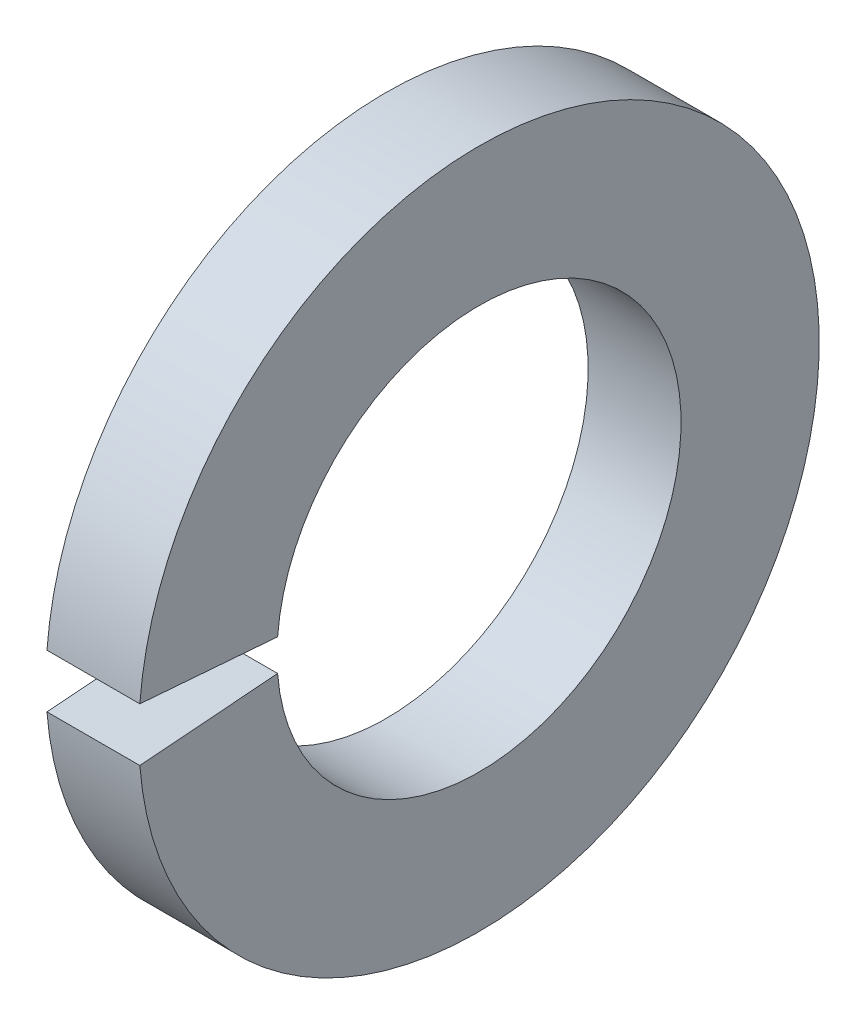
ISO-10303-21;
HEADER;
FILE_DESCRIPTION(('STEP AP214'),'2;1');
FILE_NAME('part.step','',(''),(''),'','','');
FILE_SCHEMA(('AUTOMOTIVE_DESIGN { 1 0 10303 214 1 1 1 1 }'));
ENDSEC;
DATA;
#1=APPLICATION_CONTEXT('core data for automotive mechanical design processes');
#2=APPLICATION_PROTOCOL_DEFINITION('international standard','automotive_design',2000,#1);
#3=PRODUCT_CONTEXT('',#1,'mechanical');
#4=PRODUCT('Part','Part','',(#3));
#5=PRODUCT_RELATED_PRODUCT_CATEGORY('part','',(#4));
#6=PRODUCT_DEFINITION_FORMATION('','',#4);
#7=PRODUCT_DEFINITION_CONTEXT('part definition',#1,'design');
#8=PRODUCT_DEFINITION('design','',#6,#7);
#9=PRODUCT_DEFINITION_SHAPE('','',#8);
#10=(LENGTH_UNIT() NAMED_UNIT(*) SI_UNIT(.MILLI.,.METRE.));
#11=(NAMED_UNIT(*) PLANE_ANGLE_UNIT() SI_UNIT($,.RADIAN.));
#12=(NAMED_UNIT(*) SI_UNIT($,.STERADIAN.) SOLID_ANGLE_UNIT());
#13=UNCERTAINTY_MEASURE_WITH_UNIT(LENGTH_MEASURE(1.E-05),#10,'distance_accuracy_value','');
#14=(GEOMETRIC_REPRESENTATION_CONTEXT(3) GLOBAL_UNCERTAINTY_ASSIGNED_CONTEXT((#13)) GLOBAL_UNIT_ASSIGNED_CONTEXT((#10,
#11,#12)) REPRESENTATION_CONTEXT('',''));
#15=CARTESIAN_POINT('',(0.,0.,0.));
#16=DIRECTION('',(0.,0.,1.));
#17=DIRECTION('',(1.,0.,0.));
#18=AXIS2_PLACEMENT_3D('',#15,#16,#17);
#19=CARTESIAN_POINT('',(-1.016,0.173378909739391,2.20298792408347));
#20=DIRECTION('',(-1.,0.,0.));
#21=DIRECTION('',(0.,0.,1.));
#22=AXIS2_PLACEMENT_3D('',#19,#20,#21);
#23=PLANE('',#22);
#24=CARTESIAN_POINT('',(-1.016,0.,0.));
#25=DIRECTION('',(-1.,0.,0.));
#26=DIRECTION('',(0.,0.,1.));
#27=AXIS2_PLACEMENT_3D('',#24,#25,#26);
#28=CIRCLE('',#27,2.2098);
#29=CARTESIAN_POINT('',(-1.016,0.173378909739391,2.20298792408347));
#30=VERTEX_POINT('',#29);
#31=CARTESIAN_POINT('',(-1.016,-0.173378909739393,2.20298792408347));
#32=VERTEX_POINT('',#31);
#33=EDGE_CURVE('E11',#30,#32,#28,.T.);
#34=ORIENTED_EDGE('',*,*,#33,.F.);
#35=DIRECTION('',(0.,0.0784590957278445,0.996917333733128));
#36=VECTOR('',#35,1.);
#37=CARTESIAN_POINT('',(-1.016,0.173378909739391,2.20298792408347));
#38=LINE('',#37,#36);
#39=CARTESIAN_POINT('',(-1.016,0.291954141112882,3.70962909055434));
#40=VERTEX_POINT('',#39);
#41=EDGE_CURVE('E74',#30,#40,#38,.T.);
#42=ORIENTED_EDGE('',*,*,#41,.T.);
#43=CARTESIAN_POINT('',(-1.016,0.,0.));
#44=DIRECTION('',(-1.,0.,0.));
#45=DIRECTION('',(0.,0.,1.));
#46=AXIS2_PLACEMENT_3D('',#43,#44,#45);
#47=CIRCLE('',#46,3.7211);
#48=CARTESIAN_POINT('',(-1.016,-0.291954141112886,3.70962909055434));
#49=VERTEX_POINT('',#48);
#50=EDGE_CURVE('E69',#40,#49,#47,.T.);
#51=ORIENTED_EDGE('',*,*,#50,.T.);
#52=DIRECTION('',(0.,-0.0784590957278456,0.996917333733128));
#53=VECTOR('',#52,1.);
#54=CARTESIAN_POINT('',(-1.016,-0.173378909739393,2.20298792408347));
#55=LINE('',#54,#53);
#56=EDGE_CURVE('E72',#32,#49,#55,.T.);
#57=ORIENTED_EDGE('',*,*,#56,.F.);
#58=EDGE_LOOP('',(#34,#42,#51,#57));
#59=FACE_BOUND('',#58,.T.);
#60=ADVANCED_FACE('F33',(#59),#23,.T.);
#61=CARTESIAN_POINT('',(0.,0.,0.));
#62=DIRECTION('',(-1.,0.,0.));
#63=DIRECTION('',(0.,0.,1.));
#64=AXIS2_PLACEMENT_3D('',#61,#62,#63);
#65=CYLINDRICAL_SURFACE('',#64,2.2098);
#66=CARTESIAN_POINT('',(0.,0.,0.));
#67=DIRECTION('',(-1.,0.,0.));
#68=DIRECTION('',(0.,0.,1.));
#69=AXIS2_PLACEMENT_3D('',#66,#67,#68);
#70=CIRCLE('',#69,2.2098);
#71=CARTESIAN_POINT('',(0.,0.173378909739391,2.20298792408347));
#72=VERTEX_POINT('',#71);
#73=CARTESIAN_POINT('',(0.,-0.173378909739393,2.20298792408347));
#74=VERTEX_POINT('',#73);
#75=EDGE_CURVE('E41',#72,#74,#70,.T.);
#76=ORIENTED_EDGE('',*,*,#75,.F.);
#77=DIRECTION('',(-1.,0.,0.));
#78=VECTOR('',#77,1.);
#79=CARTESIAN_POINT('',(0.,0.173378909739391,2.20298792408347));
#80=LINE('',#79,#78);
#81=EDGE_CURVE('E79',#72,#30,#80,.T.);
#82=ORIENTED_EDGE('',*,*,#81,.T.);
#83=ORIENTED_EDGE('',*,*,#33,.T.);
#84=DIRECTION('',(-1.,0.,0.));
#85=VECTOR('',#84,1.);
#86=CARTESIAN_POINT('',(0.,-0.173378909739393,2.20298792408347));
#87=LINE('',#86,#85);
#88=EDGE_CURVE('E91',#74,#32,#87,.T.);
#89=ORIENTED_EDGE('',*,*,#88,.F.);
#90=EDGE_LOOP('',(#76,#82,#83,#89));
#91=FACE_BOUND('',#90,.T.);
#92=ADVANCED_FACE('F35',(#91),#65,.F.);
#93=CARTESIAN_POINT('',(0.,0.291954141112882,3.70962909055434));
#94=DIRECTION('',(1.,0.,0.));
#95=DIRECTION('',(0.,0.,-1.));
#96=AXIS2_PLACEMENT_3D('',#93,#94,#95);
#97=PLANE('',#96);
#98=CARTESIAN_POINT('',(0.,0.,0.));
#99=DIRECTION('',(-1.,0.,0.));
#100=DIRECTION('',(0.,0.,1.));
#101=AXIS2_PLACEMENT_3D('',#98,#99,#100);
#102=CIRCLE('',#101,3.7211);
#103=CARTESIAN_POINT('',(0.,0.291954141112882,3.70962909055434));
#104=VERTEX_POINT('',#103);
#105=CARTESIAN_POINT('',(0.,-0.291954141112886,3.70962909055434));
#106=VERTEX_POINT('',#105);
#107=EDGE_CURVE('E78',#104,#106,#102,.T.);
#108=ORIENTED_EDGE('',*,*,#107,.F.);
#109=DIRECTION('',(0.,-0.0784590957278445,-0.996917333733128));
#110=VECTOR('',#109,1.);
#111=CARTESIAN_POINT('',(0.,0.291954141112882,3.70962909055434));
#112=LINE('',#111,#110);
#113=EDGE_CURVE('E99',#104,#72,#112,.T.);
#114=ORIENTED_EDGE('',*,*,#113,.T.);
#115=ORIENTED_EDGE('',*,*,#75,.T.);
#116=DIRECTION('',(0.,0.0784590957278456,-0.996917333733128));
#117=VECTOR('',#116,1.);
#118=CARTESIAN_POINT('',(0.,-0.291954141112886,3.70962909055434));
#119=LINE('',#118,#117);
#120=EDGE_CURVE('E87',#106,#74,#119,.T.);
#121=ORIENTED_EDGE('',*,*,#120,.F.);
#122=EDGE_LOOP('',(#108,#114,#115,#121));
#123=FACE_BOUND('',#122,.T.);
#124=ADVANCED_FACE('F103',(#123),#97,.T.);
#125=CARTESIAN_POINT('',(0.,0.,0.));
#126=DIRECTION('',(-1.,0.,0.));
#127=DIRECTION('',(0.,0.,1.));
#128=AXIS2_PLACEMENT_3D('',#125,#126,#127);
#129=CYLINDRICAL_SURFACE('',#128,3.7211);
#130=DIRECTION('',(1.,0.,0.));
#131=VECTOR('',#130,1.);
#132=CARTESIAN_POINT('',(-1.016,0.291954141112882,3.70962909055434));
#133=LINE('',#132,#131);
#134=EDGE_CURVE('E97',#40,#104,#133,.T.);
#135=ORIENTED_EDGE('',*,*,#134,.T.);
#136=ORIENTED_EDGE('',*,*,#107,.T.);
#137=DIRECTION('',(1.,0.,0.));
#138=VECTOR('',#137,1.);
#139=CARTESIAN_POINT('',(-1.016,-0.291954141112886,3.70962909055434));
#140=LINE('',#139,#138);
#141=EDGE_CURVE('E82',#49,#106,#140,.T.);
#142=ORIENTED_EDGE('',*,*,#141,.F.);
#143=ORIENTED_EDGE('',*,*,#50,.F.);
#144=EDGE_LOOP('',(#135,#136,#142,#143));
#145=FACE_BOUND('',#144,.T.);
#146=ADVANCED_FACE('F83',(#145),#129,.T.);
#147=CARTESIAN_POINT('',(0.,0.,0.));
#148=DIRECTION('',(0.,0.996917333733128,-0.0784590957278445));
#149=DIRECTION('',(0.,0.0784590957278445,0.996917333733128));
#150=AXIS2_PLACEMENT_3D('',#147,#148,#149);
#151=PLANE('',#150);
#152=ORIENTED_EDGE('',*,*,#41,.F.);
#153=ORIENTED_EDGE('',*,*,#81,.F.);
#154=ORIENTED_EDGE('',*,*,#113,.F.);
#155=ORIENTED_EDGE('',*,*,#134,.F.);
#156=EDGE_LOOP('',(#152,#153,#154,#155));
#157=FACE_BOUND('',#156,.T.);
#158=ADVANCED_FACE('F107',(#157),#151,.F.);
#159=CARTESIAN_POINT('',(0.,0.,0.));
#160=DIRECTION('',(0.,0.996917333733128,0.0784590957278456));
#161=DIRECTION('',(0.,-0.0784590957278456,0.996917333733128));
#162=AXIS2_PLACEMENT_3D('',#159,#160,#161);
#163=PLANE('',#162);
#164=ORIENTED_EDGE('',*,*,#56,.T.);
#165=ORIENTED_EDGE('',*,*,#141,.T.);
#166=ORIENTED_EDGE('',*,*,#120,.T.);
#167=ORIENTED_EDGE('',*,*,#88,.T.);
#168=EDGE_LOOP('',(#164,#165,#166,#167));
#169=FACE_BOUND('',#168,.T.);
#170=ADVANCED_FACE('F90',(#169),#163,.T.);
#171=CLOSED_SHELL('',(#60,#92,#124,#146,#158,#170));
#172=MANIFOLD_SOLID_BREP('B2',#171);
#173=ADVANCED_BREP_SHAPE_REPRESENTATION('',(#18,#172),#14);
#174=SHAPE_DEFINITION_REPRESENTATION(#9,#173);
ENDSEC;
END-ISO-10303-21;
